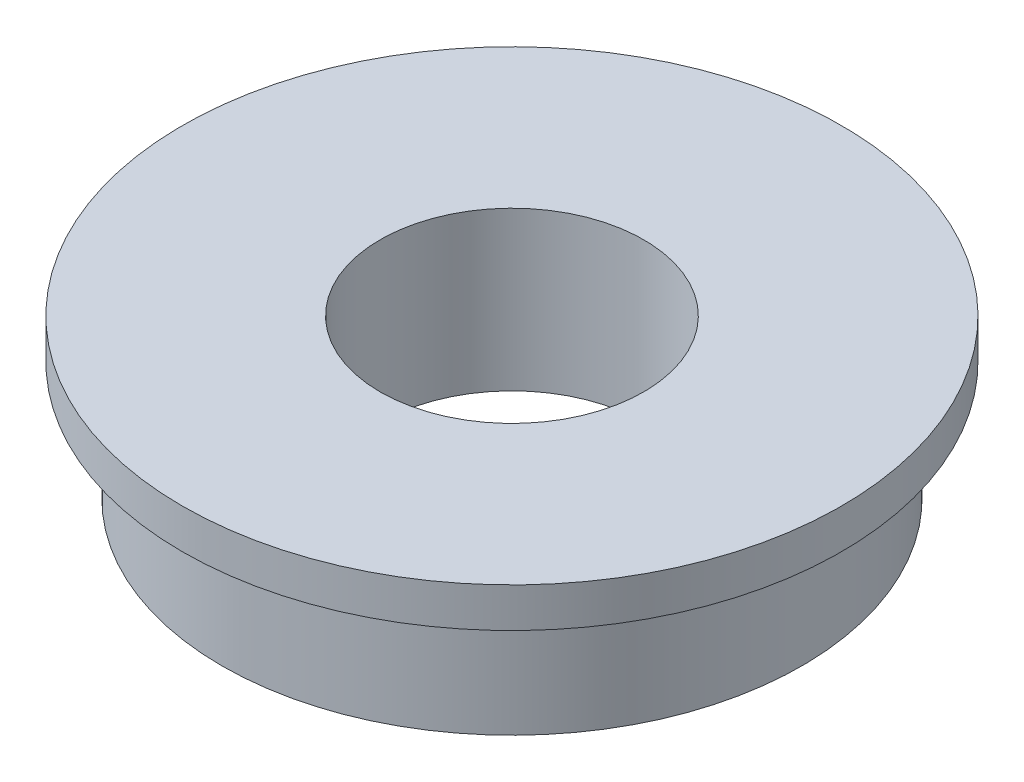
ISO-10303-21;
HEADER;
FILE_DESCRIPTION(('STEP AP214'),'2;1');
FILE_NAME('part.step','',(''),(''),'','','');
FILE_SCHEMA(('AUTOMOTIVE_DESIGN { 1 0 10303 214 1 1 1 1 }'));
ENDSEC;
DATA;
#1=APPLICATION_CONTEXT('core data for automotive mechanical design processes');
#2=APPLICATION_PROTOCOL_DEFINITION('international standard','automotive_design',2000,#1);
#3=PRODUCT_CONTEXT('',#1,'mechanical');
#4=PRODUCT('Part','Part','',(#3));
#5=PRODUCT_RELATED_PRODUCT_CATEGORY('part','',(#4));
#6=PRODUCT_DEFINITION_FORMATION('','',#4);
#7=PRODUCT_DEFINITION_CONTEXT('part definition',#1,'design');
#8=PRODUCT_DEFINITION('design','',#6,#7);
#9=PRODUCT_DEFINITION_SHAPE('','',#8);
#10=(LENGTH_UNIT() NAMED_UNIT(*) SI_UNIT(.MILLI.,.METRE.));
#11=(NAMED_UNIT(*) PLANE_ANGLE_UNIT() SI_UNIT($,.RADIAN.));
#12=(NAMED_UNIT(*) SI_UNIT($,.STERADIAN.) SOLID_ANGLE_UNIT());
#13=UNCERTAINTY_MEASURE_WITH_UNIT(LENGTH_MEASURE(1.E-05),#10,'distance_accuracy_value','');
#14=(GEOMETRIC_REPRESENTATION_CONTEXT(3) GLOBAL_UNCERTAINTY_ASSIGNED_CONTEXT((#13)) GLOBAL_UNIT_ASSIGNED_CONTEXT((#10,
#11,#12)) REPRESENTATION_CONTEXT('',''));
#15=CARTESIAN_POINT('',(0.,0.,0.));
#16=DIRECTION('',(0.,0.,1.));
#17=DIRECTION('',(1.,0.,0.));
#18=AXIS2_PLACEMENT_3D('',#15,#16,#17);
#19=CARTESIAN_POINT('',(0.,0.,0.));
#20=DIRECTION('',(0.,1.,0.));
#21=DIRECTION('',(0.,0.,1.));
#22=AXIS2_PLACEMENT_3D('',#19,#20,#21);
#23=PLANE('',#22);
#24=CARTESIAN_POINT('',(0.,0.,0.));
#25=DIRECTION('',(0.,1.,0.));
#26=DIRECTION('',(0.,0.,1.));
#27=AXIS2_PLACEMENT_3D('',#24,#25,#26);
#28=CIRCLE('',#27,11.);
#29=CARTESIAN_POINT('',(0.,0.,11.));
#30=VERTEX_POINT('',#29);
#31=EDGE_CURVE('E36',#30,#30,#28,.T.);
#32=ORIENTED_EDGE('',*,*,#31,.F.);
#33=EDGE_LOOP('',(#32));
#34=FACE_BOUND('',#33,.T.);
#35=CARTESIAN_POINT('',(0.,0.,0.));
#36=DIRECTION('',(0.,1.,0.));
#37=DIRECTION('',(0.,0.,1.));
#38=AXIS2_PLACEMENT_3D('',#35,#36,#37);
#39=CIRCLE('',#38,5.);
#40=CARTESIAN_POINT('',(0.,0.,5.));
#41=VERTEX_POINT('',#40);
#42=EDGE_CURVE('E43',#41,#41,#39,.T.);
#43=ORIENTED_EDGE('',*,*,#42,.T.);
#44=EDGE_LOOP('',(#43));
#45=FACE_BOUND('',#44,.T.);
#46=ADVANCED_FACE('F32',(#34,#45),#23,.F.);
#47=CARTESIAN_POINT('',(0.,4.5,0.));
#48=DIRECTION('',(0.,-1.,0.));
#49=DIRECTION('',(0.,0.,-1.));
#50=AXIS2_PLACEMENT_3D('',#47,#48,#49);
#51=CYLINDRICAL_SURFACE('',#50,11.);
#52=CARTESIAN_POINT('',(0.,4.5,0.));
#53=DIRECTION('',(0.,1.,0.));
#54=DIRECTION('',(0.,0.,1.));
#55=AXIS2_PLACEMENT_3D('',#52,#53,#54);
#56=CIRCLE('',#55,11.);
#57=CARTESIAN_POINT('',(0.,4.5,11.));
#58=VERTEX_POINT('',#57);
#59=EDGE_CURVE('E10',#58,#58,#56,.T.);
#60=ORIENTED_EDGE('',*,*,#59,.F.);
#61=EDGE_LOOP('',(#60));
#62=FACE_BOUND('',#61,.T.);
#63=ORIENTED_EDGE('',*,*,#31,.T.);
#64=EDGE_LOOP('',(#63));
#65=FACE_BOUND('',#64,.T.);
#66=ADVANCED_FACE('F34',(#62,#65),#51,.T.);
#67=CARTESIAN_POINT('',(0.,4.5,0.));
#68=DIRECTION('',(0.,-1.,0.));
#69=DIRECTION('',(0.,0.,-1.));
#70=AXIS2_PLACEMENT_3D('',#67,#68,#69);
#71=CYLINDRICAL_SURFACE('',#70,5.);
#72=ORIENTED_EDGE('',*,*,#42,.F.);
#73=EDGE_LOOP('',(#72));
#74=FACE_BOUND('',#73,.T.);
#75=CARTESIAN_POINT('',(0.,6.,0.));
#76=DIRECTION('',(0.,1.,0.));
#77=DIRECTION('',(0.,0.,1.));
#78=AXIS2_PLACEMENT_3D('',#75,#76,#77);
#79=CIRCLE('',#78,5.);
#80=CARTESIAN_POINT('',(0.,6.,5.));
#81=VERTEX_POINT('',#80);
#82=EDGE_CURVE('E51',#81,#81,#79,.T.);
#83=ORIENTED_EDGE('',*,*,#82,.T.);
#84=EDGE_LOOP('',(#83));
#85=FACE_BOUND('',#84,.T.);
#86=ADVANCED_FACE('F57',(#74,#85),#71,.F.);
#87=CARTESIAN_POINT('',(0.,6.,0.));
#88=DIRECTION('',(0.,1.,0.));
#89=DIRECTION('',(0.,0.,1.));
#90=AXIS2_PLACEMENT_3D('',#87,#88,#89);
#91=PLANE('',#90);
#92=CARTESIAN_POINT('',(0.,6.,0.));
#93=DIRECTION('',(0.,1.,0.));
#94=DIRECTION('',(0.,0.,1.));
#95=AXIS2_PLACEMENT_3D('',#92,#93,#94);
#96=CIRCLE('',#95,12.5);
#97=CARTESIAN_POINT('',(0.,6.,12.5));
#98=VERTEX_POINT('',#97);
#99=EDGE_CURVE('E47',#98,#98,#96,.T.);
#100=ORIENTED_EDGE('',*,*,#99,.T.);
#101=EDGE_LOOP('',(#100));
#102=FACE_BOUND('',#101,.T.);
#103=ORIENTED_EDGE('',*,*,#82,.F.);
#104=EDGE_LOOP('',(#103));
#105=FACE_BOUND('',#104,.T.);
#106=ADVANCED_FACE('F59',(#102,#105),#91,.T.);
#107=CARTESIAN_POINT('',(0.,4.5,0.));
#108=DIRECTION('',(0.,1.,0.));
#109=DIRECTION('',(0.,0.,1.));
#110=AXIS2_PLACEMENT_3D('',#107,#108,#109);
#111=PLANE('',#110);
#112=ORIENTED_EDGE('',*,*,#59,.T.);
#113=EDGE_LOOP('',(#112));
#114=FACE_BOUND('',#113,.T.);
#115=CARTESIAN_POINT('',(0.,4.5,0.));
#116=DIRECTION('',(0.,1.,0.));
#117=DIRECTION('',(0.,0.,1.));
#118=AXIS2_PLACEMENT_3D('',#115,#116,#117);
#119=CIRCLE('',#118,12.5);
#120=CARTESIAN_POINT('',(0.,4.5,12.5));
#121=VERTEX_POINT('',#120);
#122=EDGE_CURVE('E48',#121,#121,#119,.T.);
#123=ORIENTED_EDGE('',*,*,#122,.F.);
#124=EDGE_LOOP('',(#123));
#125=FACE_BOUND('',#124,.T.);
#126=ADVANCED_FACE('F61',(#114,#125),#111,.F.);
#127=CARTESIAN_POINT('',(0.,6.,0.));
#128=DIRECTION('',(0.,-1.,0.));
#129=DIRECTION('',(0.,0.,-1.));
#130=AXIS2_PLACEMENT_3D('',#127,#128,#129);
#131=CYLINDRICAL_SURFACE('',#130,12.5);
#132=ORIENTED_EDGE('',*,*,#99,.F.);
#133=EDGE_LOOP('',(#132));
#134=FACE_BOUND('',#133,.T.);
#135=ORIENTED_EDGE('',*,*,#122,.T.);
#136=EDGE_LOOP('',(#135));
#137=FACE_BOUND('',#136,.T.);
#138=ADVANCED_FACE('F68',(#134,#137),#131,.T.);
#139=CLOSED_SHELL('',(#46,#66,#86,#106,#126,#138));
#140=MANIFOLD_SOLID_BREP('B2',#139);
#141=ADVANCED_BREP_SHAPE_REPRESENTATION('',(#18,#140),#14);
#142=SHAPE_DEFINITION_REPRESENTATION(#9,#141);
ENDSEC;
END-ISO-10303-21;
